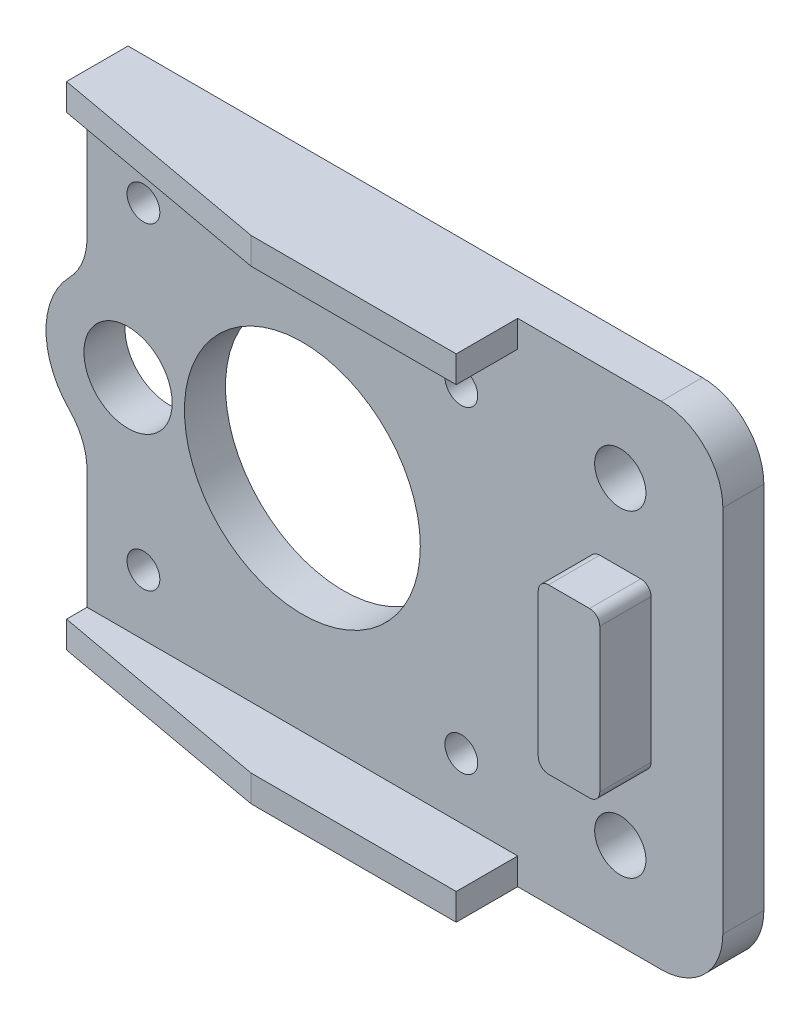
ISO-10303-21;
HEADER;
FILE_DESCRIPTION(('STEP AP214'),'2;1');
FILE_NAME('part.step','',(''),(''),'','','');
FILE_SCHEMA(('AUTOMOTIVE_DESIGN { 1 0 10303 214 1 1 1 1 }'));
ENDSEC;
DATA;
#1=APPLICATION_CONTEXT('core data for automotive mechanical design processes');
#2=APPLICATION_PROTOCOL_DEFINITION('international standard','automotive_design',2000,#1);
#3=PRODUCT_CONTEXT('',#1,'mechanical');
#4=PRODUCT('Part','Part','',(#3));
#5=PRODUCT_RELATED_PRODUCT_CATEGORY('part','',(#4));
#6=PRODUCT_DEFINITION_FORMATION('','',#4);
#7=PRODUCT_DEFINITION_CONTEXT('part definition',#1,'design');
#8=PRODUCT_DEFINITION('design','',#6,#7);
#9=PRODUCT_DEFINITION_SHAPE('','',#8);
#10=(LENGTH_UNIT() NAMED_UNIT(*) SI_UNIT(.MILLI.,.METRE.));
#11=(NAMED_UNIT(*) PLANE_ANGLE_UNIT() SI_UNIT($,.RADIAN.));
#12=(NAMED_UNIT(*) SI_UNIT($,.STERADIAN.) SOLID_ANGLE_UNIT());
#13=UNCERTAINTY_MEASURE_WITH_UNIT(LENGTH_MEASURE(1.E-05),#10,'distance_accuracy_value','');
#14=(GEOMETRIC_REPRESENTATION_CONTEXT(3) GLOBAL_UNCERTAINTY_ASSIGNED_CONTEXT((#13)) GLOBAL_UNIT_ASSIGNED_CONTEXT((#10,
#11,#12)) REPRESENTATION_CONTEXT('',''));
#15=CARTESIAN_POINT('',(0.,0.,0.));
#16=DIRECTION('',(0.,0.,1.));
#17=DIRECTION('',(1.,0.,0.));
#18=AXIS2_PLACEMENT_3D('',#15,#16,#17);
#19=CARTESIAN_POINT('',(35.,-18.,4.));
#20=DIRECTION('',(0.,0.,1.));
#21=DIRECTION('',(1.,0.,0.));
#22=AXIS2_PLACEMENT_3D('',#19,#20,#21);
#23=PLANE('',#22);
#24=DIRECTION('',(1.,0.,0.));
#25=VECTOR('',#24,1.);
#26=CARTESIAN_POINT('',(-21.,-21.4,4.));
#27=LINE('',#26,#25);
#28=CARTESIAN_POINT('',(-21.,-21.4,4.));
#29=VERTEX_POINT('',#28);
#30=CARTESIAN_POINT('',(21.,-21.4,4.));
#31=VERTEX_POINT('',#30);
#32=EDGE_CURVE('E250',#29,#31,#27,.T.);
#33=ORIENTED_EDGE('',*,*,#32,.T.);
#34=DIRECTION('',(0.,1.,0.));
#35=VECTOR('',#34,1.);
#36=CARTESIAN_POINT('',(21.,-24.,4.));
#37=LINE('',#36,#35);
#38=CARTESIAN_POINT('',(21.,-24.,4.));
#39=VERTEX_POINT('',#38);
#40=EDGE_CURVE('E247',#39,#31,#37,.T.);
#41=ORIENTED_EDGE('',*,*,#40,.F.);
#42=DIRECTION('',(1.,0.,0.));
#43=VECTOR('',#42,1.);
#44=CARTESIAN_POINT('',(-21.,-24.,4.));
#45=LINE('',#44,#43);
#46=CARTESIAN_POINT('',(35.,-24.,4.));
#47=VERTEX_POINT('',#46);
#48=EDGE_CURVE('E350',#39,#47,#45,.T.);
#49=ORIENTED_EDGE('',*,*,#48,.T.);
#50=CARTESIAN_POINT('',(35.,-18.,4.));
#51=DIRECTION('',(0.,0.,1.));
#52=DIRECTION('',(1.,0.,0.));
#53=AXIS2_PLACEMENT_3D('',#50,#51,#52);
#54=CIRCLE('',#53,6.);
#55=CARTESIAN_POINT('',(41.,-18.,4.));
#56=VERTEX_POINT('',#55);
#57=EDGE_CURVE('E353',#47,#56,#54,.T.);
#58=ORIENTED_EDGE('',*,*,#57,.T.);
#59=DIRECTION('',(0.,1.,0.));
#60=VECTOR('',#59,1.);
#61=CARTESIAN_POINT('',(41.,18.,4.));
#62=LINE('',#61,#60);
#63=CARTESIAN_POINT('',(41.,18.,4.));
#64=VERTEX_POINT('',#63);
#65=EDGE_CURVE('E355',#56,#64,#62,.T.);
#66=ORIENTED_EDGE('',*,*,#65,.T.);
#67=CARTESIAN_POINT('',(35.,18.,4.));
#68=DIRECTION('',(0.,0.,1.));
#69=DIRECTION('',(-1.,0.,0.));
#70=AXIS2_PLACEMENT_3D('',#67,#68,#69);
#71=CIRCLE('',#70,6.);
#72=CARTESIAN_POINT('',(35.,24.,4.));
#73=VERTEX_POINT('',#72);
#74=EDGE_CURVE('E357',#64,#73,#71,.T.);
#75=ORIENTED_EDGE('',*,*,#74,.T.);
#76=DIRECTION('',(-1.,0.,0.));
#77=VECTOR('',#76,1.);
#78=CARTESIAN_POINT('',(-21.,24.,4.));
#79=LINE('',#78,#77);
#80=CARTESIAN_POINT('',(21.,24.,4.));
#81=VERTEX_POINT('',#80);
#82=EDGE_CURVE('E359',#73,#81,#79,.T.);
#83=ORIENTED_EDGE('',*,*,#82,.T.);
#84=DIRECTION('',(0.,-1.,0.));
#85=VECTOR('',#84,1.);
#86=CARTESIAN_POINT('',(21.,0.,4.));
#87=LINE('',#86,#85);
#88=CARTESIAN_POINT('',(21.,21.4,4.));
#89=VERTEX_POINT('',#88);
#90=EDGE_CURVE('E253',#81,#89,#87,.T.);
#91=ORIENTED_EDGE('',*,*,#90,.T.);
#92=DIRECTION('',(1.,0.,0.));
#93=VECTOR('',#92,1.);
#94=CARTESIAN_POINT('',(0.,21.4,4.));
#95=LINE('',#94,#93);
#96=CARTESIAN_POINT('',(-21.,21.4,4.));
#97=VERTEX_POINT('',#96);
#98=EDGE_CURVE('E263',#97,#89,#95,.T.);
#99=ORIENTED_EDGE('',*,*,#98,.F.);
#100=DIRECTION('',(0.,-1.,0.));
#101=VECTOR('',#100,1.);
#102=CARTESIAN_POINT('',(-21.,24.,4.));
#103=LINE('',#102,#101);
#104=CARTESIAN_POINT('',(-21.,9.79795897113272,4.));
#105=VERTEX_POINT('',#104);
#106=EDGE_CURVE('E367',#97,#105,#103,.T.);
#107=ORIENTED_EDGE('',*,*,#106,.T.);
#108=CARTESIAN_POINT('',(-27.,9.79795897113272,4.));
#109=DIRECTION('',(0.,0.,-1.));
#110=DIRECTION('',(-1.,0.,0.));
#111=AXIS2_PLACEMENT_3D('',#108,#109,#110);
#112=CIRCLE('',#111,6.);
#113=CARTESIAN_POINT('',(-22.7142857142857,5.59883369779013,4.));
#114=VERTEX_POINT('',#113);
#115=EDGE_CURVE('E369',#105,#114,#112,.T.);
#116=ORIENTED_EDGE('',*,*,#115,.T.);
#117=CARTESIAN_POINT('',(-17.,0.,4.));
#118=DIRECTION('',(0.,0.,1.));
#119=DIRECTION('',(1.,0.,0.));
#120=AXIS2_PLACEMENT_3D('',#117,#118,#119);
#121=CIRCLE('',#120,8.);
#122=CARTESIAN_POINT('',(-22.7142857142857,-5.59883369779012,4.));
#123=VERTEX_POINT('',#122);
#124=EDGE_CURVE('E399',#114,#123,#121,.T.);
#125=ORIENTED_EDGE('',*,*,#124,.T.);
#126=CARTESIAN_POINT('',(-27.,-9.79795897113271,4.));
#127=DIRECTION('',(0.,0.,-1.));
#128=DIRECTION('',(1.,0.,0.));
#129=AXIS2_PLACEMENT_3D('',#126,#127,#128);
#130=CIRCLE('',#129,6.);
#131=CARTESIAN_POINT('',(-21.,-9.79795897113271,4.));
#132=VERTEX_POINT('',#131);
#133=EDGE_CURVE('E400',#123,#132,#130,.T.);
#134=ORIENTED_EDGE('',*,*,#133,.T.);
#135=DIRECTION('',(0.,-1.,0.));
#136=VECTOR('',#135,1.);
#137=CARTESIAN_POINT('',(-21.,-9.79795897113271,4.));
#138=LINE('',#137,#136);
#139=EDGE_CURVE('E347',#132,#29,#138,.T.);
#140=ORIENTED_EDGE('',*,*,#139,.T.);
#141=EDGE_LOOP('',(#33,#41,#49,#58,#66,#75,#83,#91,#99,#107,#116,#125,#134,#140));
#142=FACE_BOUND('',#141,.T.);
#143=CARTESIAN_POINT('',(31.,-15.5,4.));
#144=DIRECTION('',(0.,0.,1.));
#145=DIRECTION('',(-1.,0.,0.));
#146=AXIS2_PLACEMENT_3D('',#143,#144,#145);
#147=CIRCLE('',#146,2.50000000000001);
#148=CARTESIAN_POINT('',(28.5,-15.5,4.));
#149=VERTEX_POINT('',#148);
#150=EDGE_CURVE('E298',#149,#149,#147,.T.);
#151=ORIENTED_EDGE('',*,*,#150,.F.);
#152=EDGE_LOOP('',(#151));
#153=FACE_BOUND('',#152,.T.);
#154=CARTESIAN_POINT('',(-15.5,15.5,4.));
#155=DIRECTION('',(0.,0.,1.));
#156=DIRECTION('',(1.,0.,0.));
#157=AXIS2_PLACEMENT_3D('',#154,#155,#156);
#158=CIRCLE('',#157,1.6);
#159=CARTESIAN_POINT('',(-13.9,15.5,4.));
#160=VERTEX_POINT('',#159);
#161=EDGE_CURVE('E311',#160,#160,#158,.T.);
#162=ORIENTED_EDGE('',*,*,#161,.F.);
#163=EDGE_LOOP('',(#162));
#164=FACE_BOUND('',#163,.T.);
#165=CARTESIAN_POINT('',(15.5,-15.5,4.));
#166=DIRECTION('',(0.,0.,1.));
#167=DIRECTION('',(1.,0.,0.));
#168=AXIS2_PLACEMENT_3D('',#165,#166,#167);
#169=CIRCLE('',#168,1.6);
#170=CARTESIAN_POINT('',(17.1,-15.5,4.));
#171=VERTEX_POINT('',#170);
#172=EDGE_CURVE('E323',#171,#171,#169,.T.);
#173=ORIENTED_EDGE('',*,*,#172,.F.);
#174=EDGE_LOOP('',(#173));
#175=FACE_BOUND('',#174,.T.);
#176=CARTESIAN_POINT('',(15.5,15.5,4.));
#177=DIRECTION('',(0.,0.,1.));
#178=DIRECTION('',(1.,0.,0.));
#179=AXIS2_PLACEMENT_3D('',#176,#177,#178);
#180=CIRCLE('',#179,1.6);
#181=CARTESIAN_POINT('',(17.1,15.5,4.));
#182=VERTEX_POINT('',#181);
#183=EDGE_CURVE('E335',#182,#182,#180,.T.);
#184=ORIENTED_EDGE('',*,*,#183,.F.);
#185=EDGE_LOOP('',(#184));
#186=FACE_BOUND('',#185,.T.);
#187=CARTESIAN_POINT('',(0.,0.,4.));
#188=DIRECTION('',(0.,0.,1.));
#189=DIRECTION('',(1.,0.,0.));
#190=AXIS2_PLACEMENT_3D('',#187,#188,#189);
#191=CIRCLE('',#190,11.5);
#192=CARTESIAN_POINT('',(11.5,0.,4.));
#193=VERTEX_POINT('',#192);
#194=EDGE_CURVE('E341',#193,#193,#191,.T.);
#195=ORIENTED_EDGE('',*,*,#194,.F.);
#196=EDGE_LOOP('',(#195));
#197=FACE_BOUND('',#196,.T.);
#198=CARTESIAN_POINT('',(-17.,0.,4.));
#199=DIRECTION('',(0.,0.,1.));
#200=DIRECTION('',(1.,0.,0.));
#201=AXIS2_PLACEMENT_3D('',#198,#199,#200);
#202=CIRCLE('',#201,4.3);
#203=CARTESIAN_POINT('',(-12.7,0.,4.));
#204=VERTEX_POINT('',#203);
#205=EDGE_CURVE('E329',#204,#204,#202,.T.);
#206=ORIENTED_EDGE('',*,*,#205,.F.);
#207=EDGE_LOOP('',(#206));
#208=FACE_BOUND('',#207,.T.);
#209=CARTESIAN_POINT('',(-15.5,-15.5,4.));
#210=DIRECTION('',(0.,0.,1.));
#211=DIRECTION('',(1.,0.,0.));
#212=AXIS2_PLACEMENT_3D('',#209,#210,#211);
#213=CIRCLE('',#212,1.6);
#214=CARTESIAN_POINT('',(-13.9,-15.5,4.));
#215=VERTEX_POINT('',#214);
#216=EDGE_CURVE('E317',#215,#215,#213,.T.);
#217=ORIENTED_EDGE('',*,*,#216,.F.);
#218=EDGE_LOOP('',(#217));
#219=FACE_BOUND('',#218,.T.);
#220=CARTESIAN_POINT('',(31.,15.5,4.));
#221=DIRECTION('',(0.,0.,1.));
#222=DIRECTION('',(1.,0.,0.));
#223=AXIS2_PLACEMENT_3D('',#220,#221,#222);
#224=CIRCLE('',#223,2.50000000000001);
#225=CARTESIAN_POINT('',(33.5,15.5,4.));
#226=VERTEX_POINT('',#225);
#227=EDGE_CURVE('E305',#226,#226,#224,.T.);
#228=ORIENTED_EDGE('',*,*,#227,.F.);
#229=EDGE_LOOP('',(#228));
#230=FACE_BOUND('',#229,.T.);
#231=CARTESIAN_POINT('',(29.,-7.,4.));
#232=DIRECTION('',(0.,0.,1.));
#233=DIRECTION('',(1.,0.,0.));
#234=AXIS2_PLACEMENT_3D('',#231,#232,#233);
#235=CIRCLE('',#234,1.);
#236=CARTESIAN_POINT('',(28.,-6.99999999999999,4.));
#237=VERTEX_POINT('',#236);
#238=CARTESIAN_POINT('',(29.,-8.,4.));
#239=VERTEX_POINT('',#238);
#240=EDGE_CURVE('E874',#237,#239,#235,.T.);
#241=ORIENTED_EDGE('',*,*,#240,.F.);
#242=DIRECTION('',(0.,-1.,0.));
#243=VECTOR('',#242,1.);
#244=CARTESIAN_POINT('',(28.,0.,4.));
#245=LINE('',#244,#243);
#246=CARTESIAN_POINT('',(28.,6.99999999999999,4.));
#247=VERTEX_POINT('',#246);
#248=EDGE_CURVE('E231',#247,#237,#245,.T.);
#249=ORIENTED_EDGE('',*,*,#248,.F.);
#250=CARTESIAN_POINT('',(29.,7.,4.));
#251=DIRECTION('',(0.,0.,1.));
#252=DIRECTION('',(1.,0.,0.));
#253=AXIS2_PLACEMENT_3D('',#250,#251,#252);
#254=CIRCLE('',#253,1.);
#255=CARTESIAN_POINT('',(29.,8.,4.));
#256=VERTEX_POINT('',#255);
#257=EDGE_CURVE('E227',#256,#247,#254,.T.);
#258=ORIENTED_EDGE('',*,*,#257,.F.);
#259=DIRECTION('',(1.,0.,0.));
#260=VECTOR('',#259,1.);
#261=CARTESIAN_POINT('',(0.,8.00000000000001,4.));
#262=LINE('',#261,#260);
#263=CARTESIAN_POINT('',(33.,8.,4.));
#264=VERTEX_POINT('',#263);
#265=EDGE_CURVE('E870',#256,#264,#262,.T.);
#266=ORIENTED_EDGE('',*,*,#265,.T.);
#267=CARTESIAN_POINT('',(33.,7.,4.));
#268=DIRECTION('',(0.,0.,1.));
#269=DIRECTION('',(1.,0.,0.));
#270=AXIS2_PLACEMENT_3D('',#267,#268,#269);
#271=CIRCLE('',#270,1.);
#272=CARTESIAN_POINT('',(34.,6.99999999999999,4.));
#273=VERTEX_POINT('',#272);
#274=EDGE_CURVE('E888',#264,#273,#271,.F.);
#275=ORIENTED_EDGE('',*,*,#274,.T.);
#276=DIRECTION('',(0.,-1.,0.));
#277=VECTOR('',#276,1.);
#278=CARTESIAN_POINT('',(34.,0.,4.));
#279=LINE('',#278,#277);
#280=CARTESIAN_POINT('',(34.,-6.99999999999999,4.));
#281=VERTEX_POINT('',#280);
#282=EDGE_CURVE('E885',#273,#281,#279,.T.);
#283=ORIENTED_EDGE('',*,*,#282,.T.);
#284=CARTESIAN_POINT('',(33.,-7.,4.));
#285=DIRECTION('',(0.,0.,1.));
#286=DIRECTION('',(1.,0.,0.));
#287=AXIS2_PLACEMENT_3D('',#284,#285,#286);
#288=CIRCLE('',#287,1.);
#289=CARTESIAN_POINT('',(33.,-8.,4.));
#290=VERTEX_POINT('',#289);
#291=EDGE_CURVE('E882',#290,#281,#288,.T.);
#292=ORIENTED_EDGE('',*,*,#291,.F.);
#293=DIRECTION('',(1.,0.,0.));
#294=VECTOR('',#293,1.);
#295=CARTESIAN_POINT('',(0.,-7.99999999999999,4.));
#296=LINE('',#295,#294);
#297=EDGE_CURVE('E876',#239,#290,#296,.T.);
#298=ORIENTED_EDGE('',*,*,#297,.F.);
#299=EDGE_LOOP('',(#241,#249,#258,#266,#275,#283,#292,#298));
#300=FACE_BOUND('',#299,.T.);
#301=ADVANCED_FACE('F36',(#142,#153,#164,#175,#186,#197,#208,#219,#230,#300),#23,.T.);
#302=CARTESIAN_POINT('',(35.,-18.,0.));
#303=DIRECTION('',(0.,0.,1.));
#304=DIRECTION('',(1.,0.,0.));
#305=AXIS2_PLACEMENT_3D('',#302,#303,#304);
#306=PLANE('',#305);
#307=CARTESIAN_POINT('',(31.,15.5,0.));
#308=DIRECTION('',(0.,0.,1.));
#309=DIRECTION('',(1.,0.,0.));
#310=AXIS2_PLACEMENT_3D('',#307,#308,#309);
#311=CIRCLE('',#310,2.50000000000001);
#312=CARTESIAN_POINT('',(33.5,15.5,0.));
#313=VERTEX_POINT('',#312);
#314=EDGE_CURVE('E303',#313,#313,#311,.T.);
#315=ORIENTED_EDGE('',*,*,#314,.T.);
#316=EDGE_LOOP('',(#315));
#317=FACE_BOUND('',#316,.T.);
#318=CARTESIAN_POINT('',(-15.5,-15.5,0.));
#319=DIRECTION('',(0.,0.,1.));
#320=DIRECTION('',(1.,0.,0.));
#321=AXIS2_PLACEMENT_3D('',#318,#319,#320);
#322=CIRCLE('',#321,1.6);
#323=CARTESIAN_POINT('',(-13.9,-15.5,0.));
#324=VERTEX_POINT('',#323);
#325=EDGE_CURVE('E314',#324,#324,#322,.T.);
#326=ORIENTED_EDGE('',*,*,#325,.T.);
#327=EDGE_LOOP('',(#326));
#328=FACE_BOUND('',#327,.T.);
#329=CARTESIAN_POINT('',(-17.,0.,0.));
#330=DIRECTION('',(0.,0.,1.));
#331=DIRECTION('',(1.,0.,0.));
#332=AXIS2_PLACEMENT_3D('',#329,#330,#331);
#333=CIRCLE('',#332,4.3);
#334=CARTESIAN_POINT('',(-12.7,0.,0.));
#335=VERTEX_POINT('',#334);
#336=EDGE_CURVE('E326',#335,#335,#333,.T.);
#337=ORIENTED_EDGE('',*,*,#336,.T.);
#338=EDGE_LOOP('',(#337));
#339=FACE_BOUND('',#338,.T.);
#340=CARTESIAN_POINT('',(0.,0.,0.));
#341=DIRECTION('',(0.,0.,1.));
#342=DIRECTION('',(1.,0.,0.));
#343=AXIS2_PLACEMENT_3D('',#340,#341,#342);
#344=CIRCLE('',#343,11.5);
#345=CARTESIAN_POINT('',(11.5,0.,0.));
#346=VERTEX_POINT('',#345);
#347=EDGE_CURVE('E338',#346,#346,#344,.T.);
#348=ORIENTED_EDGE('',*,*,#347,.T.);
#349=EDGE_LOOP('',(#348));
#350=FACE_BOUND('',#349,.T.);
#351=DIRECTION('',(0.,-1.,0.));
#352=VECTOR('',#351,1.);
#353=CARTESIAN_POINT('',(-21.,-9.79795897113271,0.));
#354=LINE('',#353,#352);
#355=CARTESIAN_POINT('',(-21.,-9.79795897113271,0.));
#356=VERTEX_POINT('',#355);
#357=CARTESIAN_POINT('',(-21.,-24.,0.));
#358=VERTEX_POINT('',#357);
#359=EDGE_CURVE('E344',#356,#358,#354,.T.);
#360=ORIENTED_EDGE('',*,*,#359,.F.);
#361=CARTESIAN_POINT('',(-27.,-9.79795897113271,0.));
#362=DIRECTION('',(0.,0.,-1.));
#363=DIRECTION('',(1.,0.,0.));
#364=AXIS2_PLACEMENT_3D('',#361,#362,#363);
#365=CIRCLE('',#364,6.);
#366=CARTESIAN_POINT('',(-22.7142857142857,-5.59883369779012,0.));
#367=VERTEX_POINT('',#366);
#368=EDGE_CURVE('E351',#367,#356,#365,.T.);
#369=ORIENTED_EDGE('',*,*,#368,.F.);
#370=CARTESIAN_POINT('',(-17.,0.,0.));
#371=DIRECTION('',(0.,0.,1.));
#372=DIRECTION('',(1.,0.,0.));
#373=AXIS2_PLACEMENT_3D('',#370,#371,#372);
#374=CIRCLE('',#373,8.);
#375=CARTESIAN_POINT('',(-22.7142857142857,5.59883369779013,0.));
#376=VERTEX_POINT('',#375);
#377=EDGE_CURVE('E421',#376,#367,#374,.T.);
#378=ORIENTED_EDGE('',*,*,#377,.F.);
#379=CARTESIAN_POINT('',(-27.,9.79795897113272,0.));
#380=DIRECTION('',(0.,0.,-1.));
#381=DIRECTION('',(-1.,0.,0.));
#382=AXIS2_PLACEMENT_3D('',#379,#380,#381);
#383=CIRCLE('',#382,6.);
#384=CARTESIAN_POINT('',(-21.,9.79795897113272,0.));
#385=VERTEX_POINT('',#384);
#386=EDGE_CURVE('E419',#385,#376,#383,.T.);
#387=ORIENTED_EDGE('',*,*,#386,.F.);
#388=DIRECTION('',(0.,-1.,0.));
#389=VECTOR('',#388,1.);
#390=CARTESIAN_POINT('',(-21.,24.,0.));
#391=LINE('',#390,#389);
#392=CARTESIAN_POINT('',(-21.,24.,0.));
#393=VERTEX_POINT('',#392);
#394=EDGE_CURVE('E389',#393,#385,#391,.T.);
#395=ORIENTED_EDGE('',*,*,#394,.F.);
#396=DIRECTION('',(-1.,0.,0.));
#397=VECTOR('',#396,1.);
#398=CARTESIAN_POINT('',(-21.,24.,0.));
#399=LINE('',#398,#397);
#400=CARTESIAN_POINT('',(35.,24.,0.));
#401=VERTEX_POINT('',#400);
#402=EDGE_CURVE('E415',#401,#393,#399,.T.);
#403=ORIENTED_EDGE('',*,*,#402,.F.);
#404=CARTESIAN_POINT('',(35.,18.,0.));
#405=DIRECTION('',(0.,0.,1.));
#406=DIRECTION('',(-1.,0.,0.));
#407=AXIS2_PLACEMENT_3D('',#404,#405,#406);
#408=CIRCLE('',#407,6.);
#409=CARTESIAN_POINT('',(41.,18.,0.));
#410=VERTEX_POINT('',#409);
#411=EDGE_CURVE('E413',#410,#401,#408,.T.);
#412=ORIENTED_EDGE('',*,*,#411,.F.);
#413=DIRECTION('',(0.,1.,0.));
#414=VECTOR('',#413,1.);
#415=CARTESIAN_POINT('',(41.,18.,0.));
#416=LINE('',#415,#414);
#417=CARTESIAN_POINT('',(41.,-18.,0.));
#418=VERTEX_POINT('',#417);
#419=EDGE_CURVE('E411',#418,#410,#416,.T.);
#420=ORIENTED_EDGE('',*,*,#419,.F.);
#421=CARTESIAN_POINT('',(35.,-18.,0.));
#422=DIRECTION('',(0.,0.,1.));
#423=DIRECTION('',(1.,0.,0.));
#424=AXIS2_PLACEMENT_3D('',#421,#422,#423);
#425=CIRCLE('',#424,6.);
#426=CARTESIAN_POINT('',(35.,-24.,0.));
#427=VERTEX_POINT('',#426);
#428=EDGE_CURVE('E409',#427,#418,#425,.T.);
#429=ORIENTED_EDGE('',*,*,#428,.F.);
#430=DIRECTION('',(1.,0.,0.));
#431=VECTOR('',#430,1.);
#432=CARTESIAN_POINT('',(-21.,-24.,0.));
#433=LINE('',#432,#431);
#434=EDGE_CURVE('E407',#358,#427,#433,.T.);
#435=ORIENTED_EDGE('',*,*,#434,.F.);
#436=EDGE_LOOP('',(#360,#369,#378,#387,#395,#403,#412,#420,#429,#435));
#437=FACE_BOUND('',#436,.T.);
#438=CARTESIAN_POINT('',(15.5,15.5,0.));
#439=DIRECTION('',(0.,0.,1.));
#440=DIRECTION('',(1.,0.,0.));
#441=AXIS2_PLACEMENT_3D('',#438,#439,#440);
#442=CIRCLE('',#441,1.6);
#443=CARTESIAN_POINT('',(17.1,15.5,0.));
#444=VERTEX_POINT('',#443);
#445=EDGE_CURVE('E332',#444,#444,#442,.T.);
#446=ORIENTED_EDGE('',*,*,#445,.T.);
#447=EDGE_LOOP('',(#446));
#448=FACE_BOUND('',#447,.T.);
#449=CARTESIAN_POINT('',(15.5,-15.5,0.));
#450=DIRECTION('',(0.,0.,1.));
#451=DIRECTION('',(1.,0.,0.));
#452=AXIS2_PLACEMENT_3D('',#449,#450,#451);
#453=CIRCLE('',#452,1.6);
#454=CARTESIAN_POINT('',(17.1,-15.5,0.));
#455=VERTEX_POINT('',#454);
#456=EDGE_CURVE('E320',#455,#455,#453,.T.);
#457=ORIENTED_EDGE('',*,*,#456,.T.);
#458=EDGE_LOOP('',(#457));
#459=FACE_BOUND('',#458,.T.);
#460=CARTESIAN_POINT('',(-15.5,15.5,0.));
#461=DIRECTION('',(0.,0.,1.));
#462=DIRECTION('',(1.,0.,0.));
#463=AXIS2_PLACEMENT_3D('',#460,#461,#462);
#464=CIRCLE('',#463,1.6);
#465=CARTESIAN_POINT('',(-13.9,15.5,0.));
#466=VERTEX_POINT('',#465);
#467=EDGE_CURVE('E308',#466,#466,#464,.T.);
#468=ORIENTED_EDGE('',*,*,#467,.T.);
#469=EDGE_LOOP('',(#468));
#470=FACE_BOUND('',#469,.T.);
#471=CARTESIAN_POINT('',(31.,-15.5,0.));
#472=DIRECTION('',(0.,0.,1.));
#473=DIRECTION('',(-1.,0.,0.));
#474=AXIS2_PLACEMENT_3D('',#471,#472,#473);
#475=CIRCLE('',#474,2.50000000000001);
#476=CARTESIAN_POINT('',(28.5,-15.5,0.));
#477=VERTEX_POINT('',#476);
#478=EDGE_CURVE('E292',#477,#477,#475,.T.);
#479=ORIENTED_EDGE('',*,*,#478,.T.);
#480=EDGE_LOOP('',(#479));
#481=FACE_BOUND('',#480,.T.);
#482=ADVANCED_FACE('F455',(#317,#328,#339,#350,#437,#448,#459,#470,#481),#306,.F.);
#483=CARTESIAN_POINT('',(-21.,-9.79795897113271,4.));
#484=DIRECTION('',(1.,0.,0.));
#485=DIRECTION('',(0.,1.,0.));
#486=AXIS2_PLACEMENT_3D('',#483,#484,#485);
#487=PLANE('',#486);
#488=DIRECTION('',(0.,0.,-1.));
#489=VECTOR('',#488,1.);
#490=CARTESIAN_POINT('',(-21.,-24.,4.));
#491=LINE('',#490,#489);
#492=CARTESIAN_POINT('',(-21.,-24.,6.));
#493=VERTEX_POINT('',#492);
#494=EDGE_CURVE('E281',#493,#358,#491,.T.);
#495=ORIENTED_EDGE('',*,*,#494,.F.);
#496=DIRECTION('',(0.,1.,0.));
#497=VECTOR('',#496,1.);
#498=CARTESIAN_POINT('',(-21.,-9.79795897113271,6.));
#499=LINE('',#498,#497);
#500=CARTESIAN_POINT('',(-21.,-21.4,6.));
#501=VERTEX_POINT('',#500);
#502=EDGE_CURVE('E856',#493,#501,#499,.T.);
#503=ORIENTED_EDGE('',*,*,#502,.T.);
#504=DIRECTION('',(0.,0.,-1.));
#505=VECTOR('',#504,1.);
#506=CARTESIAN_POINT('',(-21.,-21.4,10.));
#507=LINE('',#506,#505);
#508=EDGE_CURVE('E242',#501,#29,#507,.T.);
#509=ORIENTED_EDGE('',*,*,#508,.T.);
#510=ORIENTED_EDGE('',*,*,#139,.F.);
#511=DIRECTION('',(0.,0.,-1.));
#512=VECTOR('',#511,1.);
#513=CARTESIAN_POINT('',(-21.,-9.79795897113271,4.));
#514=LINE('',#513,#512);
#515=EDGE_CURVE('E404',#132,#356,#514,.T.);
#516=ORIENTED_EDGE('',*,*,#515,.T.);
#517=ORIENTED_EDGE('',*,*,#359,.T.);
#518=EDGE_LOOP('',(#495,#503,#509,#510,#516,#517));
#519=FACE_BOUND('',#518,.T.);
#520=ADVANCED_FACE('F459',(#519),#487,.F.);
#521=CARTESIAN_POINT('',(-21.,-24.,4.));
#522=DIRECTION('',(0.,1.,0.));
#523=DIRECTION('',(0.,0.,1.));
#524=AXIS2_PLACEMENT_3D('',#521,#522,#523);
#525=PLANE('',#524);
#526=DIRECTION('',(1.,0.,0.));
#527=VECTOR('',#526,1.);
#528=CARTESIAN_POINT('',(-21.,-24.,10.));
#529=LINE('',#528,#527);
#530=CARTESIAN_POINT('',(1.00000000000043,-24.,10.));
#531=VERTEX_POINT('',#530);
#532=CARTESIAN_POINT('',(21.,-24.,10.));
#533=VERTEX_POINT('',#532);
#534=EDGE_CURVE('E244',#531,#533,#529,.T.);
#535=ORIENTED_EDGE('',*,*,#534,.F.);
#536=DIRECTION('',(0.983869910099908,0.,0.17888543819998));
#537=VECTOR('',#536,1.);
#538=CARTESIAN_POINT('',(-21.,-24.,6.));
#539=LINE('',#538,#537);
#540=EDGE_CURVE('E11',#531,#493,#539,.F.);
#541=ORIENTED_EDGE('',*,*,#540,.T.);
#542=ORIENTED_EDGE('',*,*,#494,.T.);
#543=ORIENTED_EDGE('',*,*,#434,.T.);
#544=DIRECTION('',(0.,0.,-1.));
#545=VECTOR('',#544,1.);
#546=CARTESIAN_POINT('',(35.,-24.,4.));
#547=LINE('',#546,#545);
#548=EDGE_CURVE('E439',#47,#427,#547,.T.);
#549=ORIENTED_EDGE('',*,*,#548,.F.);
#550=ORIENTED_EDGE('',*,*,#48,.F.);
#551=DIRECTION('',(0.,0.,-1.));
#552=VECTOR('',#551,1.);
#553=CARTESIAN_POINT('',(21.,-24.,10.));
#554=LINE('',#553,#552);
#555=EDGE_CURVE('E233',#533,#39,#554,.T.);
#556=ORIENTED_EDGE('',*,*,#555,.F.);
#557=EDGE_LOOP('',(#535,#541,#542,#543,#549,#550,#556));
#558=FACE_BOUND('',#557,.T.);
#559=ADVANCED_FACE('F448',(#558),#525,.F.);
#560=CARTESIAN_POINT('',(35.,-18.,4.));
#561=DIRECTION('',(0.,0.,-1.));
#562=DIRECTION('',(-1.,0.,0.));
#563=AXIS2_PLACEMENT_3D('',#560,#561,#562);
#564=CYLINDRICAL_SURFACE('',#563,6.);
#565=ORIENTED_EDGE('',*,*,#428,.T.);
#566=DIRECTION('',(0.,0.,-1.));
#567=VECTOR('',#566,1.);
#568=CARTESIAN_POINT('',(41.,-18.,4.));
#569=LINE('',#568,#567);
#570=EDGE_CURVE('E437',#56,#418,#569,.T.);
#571=ORIENTED_EDGE('',*,*,#570,.F.);
#572=ORIENTED_EDGE('',*,*,#57,.F.);
#573=ORIENTED_EDGE('',*,*,#548,.T.);
#574=EDGE_LOOP('',(#565,#571,#572,#573));
#575=FACE_BOUND('',#574,.T.);
#576=ADVANCED_FACE('F478',(#575),#564,.T.);
#577=CARTESIAN_POINT('',(41.,18.,4.));
#578=DIRECTION('',(-1.,0.,0.));
#579=DIRECTION('',(0.,-1.,0.));
#580=AXIS2_PLACEMENT_3D('',#577,#578,#579);
#581=PLANE('',#580);
#582=ORIENTED_EDGE('',*,*,#419,.T.);
#583=DIRECTION('',(0.,0.,-1.));
#584=VECTOR('',#583,1.);
#585=CARTESIAN_POINT('',(41.,18.,4.));
#586=LINE('',#585,#584);
#587=EDGE_CURVE('E434',#64,#410,#586,.T.);
#588=ORIENTED_EDGE('',*,*,#587,.F.);
#589=ORIENTED_EDGE('',*,*,#65,.F.);
#590=ORIENTED_EDGE('',*,*,#570,.T.);
#591=EDGE_LOOP('',(#582,#588,#589,#590));
#592=FACE_BOUND('',#591,.T.);
#593=ADVANCED_FACE('F482',(#592),#581,.F.);
#594=CARTESIAN_POINT('',(35.,18.,4.));
#595=DIRECTION('',(0.,0.,-1.));
#596=DIRECTION('',(-1.,0.,0.));
#597=AXIS2_PLACEMENT_3D('',#594,#595,#596);
#598=CYLINDRICAL_SURFACE('',#597,6.);
#599=ORIENTED_EDGE('',*,*,#411,.T.);
#600=DIRECTION('',(0.,0.,-1.));
#601=VECTOR('',#600,1.);
#602=CARTESIAN_POINT('',(35.,24.,4.));
#603=LINE('',#602,#601);
#604=EDGE_CURVE('E431',#73,#401,#603,.T.);
#605=ORIENTED_EDGE('',*,*,#604,.F.);
#606=ORIENTED_EDGE('',*,*,#74,.F.);
#607=ORIENTED_EDGE('',*,*,#587,.T.);
#608=EDGE_LOOP('',(#599,#605,#606,#607));
#609=FACE_BOUND('',#608,.T.);
#610=ADVANCED_FACE('F486',(#609),#598,.T.);
#611=CARTESIAN_POINT('',(-21.,24.,4.));
#612=DIRECTION('',(0.,-1.,0.));
#613=DIRECTION('',(0.,0.,-1.));
#614=AXIS2_PLACEMENT_3D('',#611,#612,#613);
#615=PLANE('',#614);
#616=DIRECTION('',(0.,0.,-1.));
#617=VECTOR('',#616,1.);
#618=CARTESIAN_POINT('',(-21.,24.,4.));
#619=LINE('',#618,#617);
#620=CARTESIAN_POINT('',(-21.,24.,5.99999999999999));
#621=VERTEX_POINT('',#620);
#622=EDGE_CURVE('E392',#621,#393,#619,.T.);
#623=ORIENTED_EDGE('',*,*,#622,.F.);
#624=DIRECTION('',(0.983869910099908,0.,0.17888543819998));
#625=VECTOR('',#624,1.);
#626=CARTESIAN_POINT('',(1.00000000000041,24.,10.));
#627=LINE('',#626,#625);
#628=CARTESIAN_POINT('',(1.0000000000004,24.,10.));
#629=VERTEX_POINT('',#628);
#630=EDGE_CURVE('E857',#621,#629,#627,.T.);
#631=ORIENTED_EDGE('',*,*,#630,.T.);
#632=DIRECTION('',(-1.,0.,0.));
#633=VECTOR('',#632,1.);
#634=CARTESIAN_POINT('',(0.,24.,10.));
#635=LINE('',#634,#633);
#636=CARTESIAN_POINT('',(21.,24.,10.));
#637=VERTEX_POINT('',#636);
#638=EDGE_CURVE('E262',#637,#629,#635,.T.);
#639=ORIENTED_EDGE('',*,*,#638,.F.);
#640=DIRECTION('',(0.,0.,-1.));
#641=VECTOR('',#640,1.);
#642=CARTESIAN_POINT('',(21.,24.,10.));
#643=LINE('',#642,#641);
#644=EDGE_CURVE('E285',#637,#81,#643,.T.);
#645=ORIENTED_EDGE('',*,*,#644,.T.);
#646=ORIENTED_EDGE('',*,*,#82,.F.);
#647=ORIENTED_EDGE('',*,*,#604,.T.);
#648=ORIENTED_EDGE('',*,*,#402,.T.);
#649=EDGE_LOOP('',(#623,#631,#639,#645,#646,#647,#648));
#650=FACE_BOUND('',#649,.T.);
#651=ADVANCED_FACE('F490',(#650),#615,.F.);
#652=CARTESIAN_POINT('',(-21.,24.,4.));
#653=DIRECTION('',(1.,0.,0.));
#654=DIRECTION('',(0.,1.,0.));
#655=AXIS2_PLACEMENT_3D('',#652,#653,#654);
#656=PLANE('',#655);
#657=DIRECTION('',(0.,0.,-1.));
#658=VECTOR('',#657,1.);
#659=CARTESIAN_POINT('',(-21.,21.4,10.));
#660=LINE('',#659,#658);
#661=CARTESIAN_POINT('',(-21.,21.4,6.));
#662=VERTEX_POINT('',#661);
#663=EDGE_CURVE('E282',#662,#97,#660,.T.);
#664=ORIENTED_EDGE('',*,*,#663,.F.);
#665=DIRECTION('',(0.,1.,0.));
#666=VECTOR('',#665,1.);
#667=CARTESIAN_POINT('',(-21.,24.,6.));
#668=LINE('',#667,#666);
#669=EDGE_CURVE('E860',#662,#621,#668,.T.);
#670=ORIENTED_EDGE('',*,*,#669,.T.);
#671=ORIENTED_EDGE('',*,*,#622,.T.);
#672=ORIENTED_EDGE('',*,*,#394,.T.);
#673=DIRECTION('',(0.,0.,-1.));
#674=VECTOR('',#673,1.);
#675=CARTESIAN_POINT('',(-21.,9.79795897113272,4.));
#676=LINE('',#675,#674);
#677=EDGE_CURVE('E386',#105,#385,#676,.T.);
#678=ORIENTED_EDGE('',*,*,#677,.F.);
#679=ORIENTED_EDGE('',*,*,#106,.F.);
#680=EDGE_LOOP('',(#664,#670,#671,#672,#678,#679));
#681=FACE_BOUND('',#680,.T.);
#682=ADVANCED_FACE('F383',(#681),#656,.F.);
#683=CARTESIAN_POINT('',(-27.,9.79795897113272,4.));
#684=DIRECTION('',(0.,0.,-1.));
#685=DIRECTION('',(-1.,0.,0.));
#686=AXIS2_PLACEMENT_3D('',#683,#684,#685);
#687=CYLINDRICAL_SURFACE('',#686,6.);
#688=ORIENTED_EDGE('',*,*,#386,.T.);
#689=DIRECTION('',(0.,0.,-1.));
#690=VECTOR('',#689,1.);
#691=CARTESIAN_POINT('',(-22.7142857142857,5.59883369779013,4.));
#692=LINE('',#691,#690);
#693=EDGE_CURVE('E393',#114,#376,#692,.T.);
#694=ORIENTED_EDGE('',*,*,#693,.F.);
#695=ORIENTED_EDGE('',*,*,#115,.F.);
#696=ORIENTED_EDGE('',*,*,#677,.T.);
#697=EDGE_LOOP('',(#688,#694,#695,#696));
#698=FACE_BOUND('',#697,.T.);
#699=ADVANCED_FACE('F396',(#698),#687,.F.);
#700=CARTESIAN_POINT('',(-17.,0.,4.));
#701=DIRECTION('',(0.,0.,-1.));
#702=DIRECTION('',(-1.,0.,0.));
#703=AXIS2_PLACEMENT_3D('',#700,#701,#702);
#704=CYLINDRICAL_SURFACE('',#703,8.);
#705=ORIENTED_EDGE('',*,*,#377,.T.);
#706=DIRECTION('',(0.,0.,-1.));
#707=VECTOR('',#706,1.);
#708=CARTESIAN_POINT('',(-22.7142857142857,-5.59883369779012,4.));
#709=LINE('',#708,#707);
#710=EDGE_CURVE('E426',#123,#367,#709,.T.);
#711=ORIENTED_EDGE('',*,*,#710,.F.);
#712=ORIENTED_EDGE('',*,*,#124,.F.);
#713=ORIENTED_EDGE('',*,*,#693,.T.);
#714=EDGE_LOOP('',(#705,#711,#712,#713));
#715=FACE_BOUND('',#714,.T.);
#716=ADVANCED_FACE('F468',(#715),#704,.T.);
#717=CARTESIAN_POINT('',(-27.,-9.79795897113271,4.));
#718=DIRECTION('',(0.,0.,-1.));
#719=DIRECTION('',(-1.,0.,0.));
#720=AXIS2_PLACEMENT_3D('',#717,#718,#719);
#721=CYLINDRICAL_SURFACE('',#720,6.);
#722=ORIENTED_EDGE('',*,*,#368,.T.);
#723=ORIENTED_EDGE('',*,*,#515,.F.);
#724=ORIENTED_EDGE('',*,*,#133,.F.);
#725=ORIENTED_EDGE('',*,*,#710,.T.);
#726=EDGE_LOOP('',(#722,#723,#724,#725));
#727=FACE_BOUND('',#726,.T.);
#728=ADVANCED_FACE('F464',(#727),#721,.F.);
#729=CARTESIAN_POINT('',(0.,0.,4.));
#730=DIRECTION('',(0.,0.,-1.));
#731=DIRECTION('',(-1.,0.,0.));
#732=AXIS2_PLACEMENT_3D('',#729,#730,#731);
#733=CYLINDRICAL_SURFACE('',#732,11.5);
#734=ORIENTED_EDGE('',*,*,#194,.T.);
#735=EDGE_LOOP('',(#734));
#736=FACE_BOUND('',#735,.T.);
#737=ORIENTED_EDGE('',*,*,#347,.F.);
#738=EDGE_LOOP('',(#737));
#739=FACE_BOUND('',#738,.T.);
#740=ADVANCED_FACE('F508',(#736,#739),#733,.F.);
#741=CARTESIAN_POINT('',(15.5,15.5,4.));
#742=DIRECTION('',(0.,0.,-1.));
#743=DIRECTION('',(-1.,0.,0.));
#744=AXIS2_PLACEMENT_3D('',#741,#742,#743);
#745=CYLINDRICAL_SURFACE('',#744,1.6);
#746=ORIENTED_EDGE('',*,*,#183,.T.);
#747=EDGE_LOOP('',(#746));
#748=FACE_BOUND('',#747,.T.);
#749=ORIENTED_EDGE('',*,*,#445,.F.);
#750=EDGE_LOOP('',(#749));
#751=FACE_BOUND('',#750,.T.);
#752=ADVANCED_FACE('F535',(#748,#751),#745,.F.);
#753=CARTESIAN_POINT('',(-17.,0.,4.));
#754=DIRECTION('',(0.,0.,-1.));
#755=DIRECTION('',(-1.,0.,0.));
#756=AXIS2_PLACEMENT_3D('',#753,#754,#755);
#757=CYLINDRICAL_SURFACE('',#756,4.3);
#758=ORIENTED_EDGE('',*,*,#205,.T.);
#759=EDGE_LOOP('',(#758));
#760=FACE_BOUND('',#759,.T.);
#761=ORIENTED_EDGE('',*,*,#336,.F.);
#762=EDGE_LOOP('',(#761));
#763=FACE_BOUND('',#762,.T.);
#764=ADVANCED_FACE('F542',(#760,#763),#757,.F.);
#765=CARTESIAN_POINT('',(15.5,-15.5,4.));
#766=DIRECTION('',(0.,0.,-1.));
#767=DIRECTION('',(-1.,0.,0.));
#768=AXIS2_PLACEMENT_3D('',#765,#766,#767);
#769=CYLINDRICAL_SURFACE('',#768,1.6);
#770=ORIENTED_EDGE('',*,*,#172,.T.);
#771=EDGE_LOOP('',(#770));
#772=FACE_BOUND('',#771,.T.);
#773=ORIENTED_EDGE('',*,*,#456,.F.);
#774=EDGE_LOOP('',(#773));
#775=FACE_BOUND('',#774,.T.);
#776=ADVANCED_FACE('F549',(#772,#775),#769,.F.);
#777=CARTESIAN_POINT('',(-15.5,-15.5,4.));
#778=DIRECTION('',(0.,0.,-1.));
#779=DIRECTION('',(-1.,0.,0.));
#780=AXIS2_PLACEMENT_3D('',#777,#778,#779);
#781=CYLINDRICAL_SURFACE('',#780,1.6);
#782=ORIENTED_EDGE('',*,*,#216,.T.);
#783=EDGE_LOOP('',(#782));
#784=FACE_BOUND('',#783,.T.);
#785=ORIENTED_EDGE('',*,*,#325,.F.);
#786=EDGE_LOOP('',(#785));
#787=FACE_BOUND('',#786,.T.);
#788=ADVANCED_FACE('F557',(#784,#787),#781,.F.);
#789=CARTESIAN_POINT('',(-15.5,15.5,4.));
#790=DIRECTION('',(0.,0.,-1.));
#791=DIRECTION('',(-1.,0.,0.));
#792=AXIS2_PLACEMENT_3D('',#789,#790,#791);
#793=CYLINDRICAL_SURFACE('',#792,1.6);
#794=ORIENTED_EDGE('',*,*,#161,.T.);
#795=EDGE_LOOP('',(#794));
#796=FACE_BOUND('',#795,.T.);
#797=ORIENTED_EDGE('',*,*,#467,.F.);
#798=EDGE_LOOP('',(#797));
#799=FACE_BOUND('',#798,.T.);
#800=ADVANCED_FACE('F565',(#796,#799),#793,.F.);
#801=CARTESIAN_POINT('',(31.,15.5,4.));
#802=DIRECTION('',(0.,0.,-1.));
#803=DIRECTION('',(-1.,0.,0.));
#804=AXIS2_PLACEMENT_3D('',#801,#802,#803);
#805=CYLINDRICAL_SURFACE('',#804,2.50000000000001);
#806=ORIENTED_EDGE('',*,*,#227,.T.);
#807=EDGE_LOOP('',(#806));
#808=FACE_BOUND('',#807,.T.);
#809=ORIENTED_EDGE('',*,*,#314,.F.);
#810=EDGE_LOOP('',(#809));
#811=FACE_BOUND('',#810,.T.);
#812=ADVANCED_FACE('F573',(#808,#811),#805,.F.);
#813=CARTESIAN_POINT('',(31.,-15.5,4.));
#814=DIRECTION('',(0.,0.,-1.));
#815=DIRECTION('',(-1.,0.,0.));
#816=AXIS2_PLACEMENT_3D('',#813,#814,#815);
#817=CYLINDRICAL_SURFACE('',#816,2.50000000000001);
#818=ORIENTED_EDGE('',*,*,#150,.T.);
#819=EDGE_LOOP('',(#818));
#820=FACE_BOUND('',#819,.T.);
#821=ORIENTED_EDGE('',*,*,#478,.F.);
#822=EDGE_LOOP('',(#821));
#823=FACE_BOUND('',#822,.T.);
#824=ADVANCED_FACE('F581',(#820,#823),#817,.F.);
#825=CARTESIAN_POINT('',(21.,0.,10.));
#826=DIRECTION('',(1.,0.,0.));
#827=DIRECTION('',(0.,0.,-1.));
#828=AXIS2_PLACEMENT_3D('',#825,#826,#827);
#829=PLANE('',#828);
#830=ORIENTED_EDGE('',*,*,#90,.F.);
#831=ORIENTED_EDGE('',*,*,#644,.F.);
#832=DIRECTION('',(0.,-1.,0.));
#833=VECTOR('',#832,1.);
#834=CARTESIAN_POINT('',(21.,0.,10.));
#835=LINE('',#834,#833);
#836=CARTESIAN_POINT('',(21.,21.4,10.));
#837=VERTEX_POINT('',#836);
#838=EDGE_CURVE('E259',#637,#837,#835,.T.);
#839=ORIENTED_EDGE('',*,*,#838,.T.);
#840=DIRECTION('',(0.,0.,-1.));
#841=VECTOR('',#840,1.);
#842=CARTESIAN_POINT('',(21.,21.4,10.));
#843=LINE('',#842,#841);
#844=EDGE_CURVE('E268',#837,#89,#843,.T.);
#845=ORIENTED_EDGE('',*,*,#844,.T.);
#846=EDGE_LOOP('',(#830,#831,#839,#845));
#847=FACE_BOUND('',#846,.T.);
#848=ADVANCED_FACE('F589',(#847),#829,.T.);
#849=CARTESIAN_POINT('',(0.,21.4,10.));
#850=DIRECTION('',(0.,1.,0.));
#851=DIRECTION('',(-1.,0.,0.));
#852=AXIS2_PLACEMENT_3D('',#849,#850,#851);
#853=PLANE('',#852);
#854=DIRECTION('',(1.,0.,0.));
#855=VECTOR('',#854,1.);
#856=CARTESIAN_POINT('',(0.,21.4,10.));
#857=LINE('',#856,#855);
#858=CARTESIAN_POINT('',(1.0000000000004,21.4,10.));
#859=VERTEX_POINT('',#858);
#860=EDGE_CURVE('E266',#859,#837,#857,.T.);
#861=ORIENTED_EDGE('',*,*,#860,.F.);
#862=DIRECTION('',(-0.983869910099908,0.,-0.17888543819998));
#863=VECTOR('',#862,1.);
#864=CARTESIAN_POINT('',(1.00000000000041,21.4,10.));
#865=LINE('',#864,#863);
#866=EDGE_CURVE('E280',#859,#662,#865,.T.);
#867=ORIENTED_EDGE('',*,*,#866,.T.);
#868=ORIENTED_EDGE('',*,*,#663,.T.);
#869=ORIENTED_EDGE('',*,*,#98,.T.);
#870=ORIENTED_EDGE('',*,*,#844,.F.);
#871=EDGE_LOOP('',(#861,#867,#868,#869,#870));
#872=FACE_BOUND('',#871,.T.);
#873=ADVANCED_FACE('F375',(#872),#853,.F.);
#874=CARTESIAN_POINT('',(0.,0.,10.));
#875=DIRECTION('',(0.,0.,1.));
#876=DIRECTION('',(1.,0.,0.));
#877=AXIS2_PLACEMENT_3D('',#874,#875,#876);
#878=PLANE('',#877);
#879=ORIENTED_EDGE('',*,*,#638,.T.);
#880=DIRECTION('',(0.,-1.,0.));
#881=VECTOR('',#880,1.);
#882=CARTESIAN_POINT('',(1.0000000000004,21.4,10.));
#883=LINE('',#882,#881);
#884=EDGE_CURVE('E277',#629,#859,#883,.T.);
#885=ORIENTED_EDGE('',*,*,#884,.T.);
#886=ORIENTED_EDGE('',*,*,#860,.T.);
#887=ORIENTED_EDGE('',*,*,#838,.F.);
#888=EDGE_LOOP('',(#879,#885,#886,#887));
#889=FACE_BOUND('',#888,.T.);
#890=ADVANCED_FACE('F605',(#889),#878,.T.);
#891=CARTESIAN_POINT('',(21.,-24.,10.));
#892=DIRECTION('',(-1.,0.,0.));
#893=DIRECTION('',(0.,0.,1.));
#894=AXIS2_PLACEMENT_3D('',#891,#892,#893);
#895=PLANE('',#894);
#896=ORIENTED_EDGE('',*,*,#40,.T.);
#897=DIRECTION('',(0.,0.,-1.));
#898=VECTOR('',#897,1.);
#899=CARTESIAN_POINT('',(21.,-21.4,10.));
#900=LINE('',#899,#898);
#901=CARTESIAN_POINT('',(21.,-21.4,10.));
#902=VERTEX_POINT('',#901);
#903=EDGE_CURVE('E236',#902,#31,#900,.T.);
#904=ORIENTED_EDGE('',*,*,#903,.F.);
#905=DIRECTION('',(0.,1.,0.));
#906=VECTOR('',#905,1.);
#907=CARTESIAN_POINT('',(21.,-24.,10.));
#908=LINE('',#907,#906);
#909=EDGE_CURVE('E255',#533,#902,#908,.T.);
#910=ORIENTED_EDGE('',*,*,#909,.F.);
#911=ORIENTED_EDGE('',*,*,#555,.T.);
#912=EDGE_LOOP('',(#896,#904,#910,#911));
#913=FACE_BOUND('',#912,.T.);
#914=ADVANCED_FACE('F475',(#913),#895,.F.);
#915=CARTESIAN_POINT('',(-21.,-21.4,10.));
#916=DIRECTION('',(0.,1.,0.));
#917=DIRECTION('',(-1.,0.,0.));
#918=AXIS2_PLACEMENT_3D('',#915,#916,#917);
#919=PLANE('',#918);
#920=ORIENTED_EDGE('',*,*,#508,.F.);
#921=DIRECTION('',(-0.983869910099908,0.,-0.17888543819998));
#922=VECTOR('',#921,1.);
#923=CARTESIAN_POINT('',(-20.296,-21.4,6.12799999999999));
#924=LINE('',#923,#922);
#925=CARTESIAN_POINT('',(1.00000000000042,-21.4,10.));
#926=VERTEX_POINT('',#925);
#927=EDGE_CURVE('E58',#501,#926,#924,.F.);
#928=ORIENTED_EDGE('',*,*,#927,.T.);
#929=DIRECTION('',(1.,0.,0.));
#930=VECTOR('',#929,1.);
#931=CARTESIAN_POINT('',(-21.,-21.4,10.));
#932=LINE('',#931,#930);
#933=EDGE_CURVE('E251',#926,#902,#932,.T.);
#934=ORIENTED_EDGE('',*,*,#933,.T.);
#935=ORIENTED_EDGE('',*,*,#903,.T.);
#936=ORIENTED_EDGE('',*,*,#32,.F.);
#937=EDGE_LOOP('',(#920,#928,#934,#935,#936));
#938=FACE_BOUND('',#937,.T.);
#939=ADVANCED_FACE('F471',(#938),#919,.T.);
#940=CARTESIAN_POINT('',(0.,0.,10.));
#941=DIRECTION('',(0.,0.,-1.));
#942=DIRECTION('',(-1.,0.,0.));
#943=AXIS2_PLACEMENT_3D('',#940,#941,#942);
#944=PLANE('',#943);
#945=ORIENTED_EDGE('',*,*,#933,.F.);
#946=DIRECTION('',(0.,-1.,0.));
#947=VECTOR('',#946,1.);
#948=CARTESIAN_POINT('',(1.00000000000043,0.,10.));
#949=LINE('',#948,#947);
#950=EDGE_CURVE('E44',#926,#531,#949,.T.);
#951=ORIENTED_EDGE('',*,*,#950,.T.);
#952=ORIENTED_EDGE('',*,*,#534,.T.);
#953=ORIENTED_EDGE('',*,*,#909,.T.);
#954=EDGE_LOOP('',(#945,#951,#952,#953));
#955=FACE_BOUND('',#954,.T.);
#956=ADVANCED_FACE('F625',(#955),#944,.F.);
#957=CARTESIAN_POINT('',(28.,0.,9.));
#958=DIRECTION('',(1.,0.,0.));
#959=DIRECTION('',(0.,0.,-1.));
#960=AXIS2_PLACEMENT_3D('',#957,#958,#959);
#961=PLANE('',#960);
#962=ORIENTED_EDGE('',*,*,#248,.T.);
#963=DIRECTION('',(0.,0.,-1.));
#964=VECTOR('',#963,1.);
#965=CARTESIAN_POINT('',(28.,-6.99999999999999,9.));
#966=LINE('',#965,#964);
#967=CARTESIAN_POINT('',(28.,-6.99999999999999,9.));
#968=VERTEX_POINT('',#967);
#969=EDGE_CURVE('E210',#968,#237,#966,.T.);
#970=ORIENTED_EDGE('',*,*,#969,.F.);
#971=DIRECTION('',(0.,-1.,0.));
#972=VECTOR('',#971,1.);
#973=CARTESIAN_POINT('',(28.,0.,9.));
#974=LINE('',#973,#972);
#975=CARTESIAN_POINT('',(28.,6.99999999999999,9.));
#976=VERTEX_POINT('',#975);
#977=EDGE_CURVE('E217',#976,#968,#974,.T.);
#978=ORIENTED_EDGE('',*,*,#977,.F.);
#979=DIRECTION('',(0.,0.,-1.));
#980=VECTOR('',#979,1.);
#981=CARTESIAN_POINT('',(28.,6.99999999999999,9.));
#982=LINE('',#981,#980);
#983=EDGE_CURVE('E866',#976,#247,#982,.T.);
#984=ORIENTED_EDGE('',*,*,#983,.T.);
#985=EDGE_LOOP('',(#962,#970,#978,#984));
#986=FACE_BOUND('',#985,.T.);
#987=ADVANCED_FACE('F229',(#986),#961,.F.);
#988=CARTESIAN_POINT('',(29.,-7.,9.));
#989=DIRECTION('',(0.,0.,-1.));
#990=DIRECTION('',(-1.,0.,0.));
#991=AXIS2_PLACEMENT_3D('',#988,#989,#990);
#992=CYLINDRICAL_SURFACE('',#991,1.);
#993=ORIENTED_EDGE('',*,*,#240,.T.);
#994=DIRECTION('',(0.,0.,-1.));
#995=VECTOR('',#994,1.);
#996=CARTESIAN_POINT('',(29.,-8.,9.));
#997=LINE('',#996,#995);
#998=CARTESIAN_POINT('',(29.,-8.,9.));
#999=VERTEX_POINT('',#998);
#1000=EDGE_CURVE('E213',#999,#239,#997,.T.);
#1001=ORIENTED_EDGE('',*,*,#1000,.F.);
#1002=CARTESIAN_POINT('',(29.,-7.,9.));
#1003=DIRECTION('',(0.,0.,1.));
#1004=DIRECTION('',(1.,0.,0.));
#1005=AXIS2_PLACEMENT_3D('',#1002,#1003,#1004);
#1006=CIRCLE('',#1005,1.);
#1007=EDGE_CURVE('E206',#968,#999,#1006,.T.);
#1008=ORIENTED_EDGE('',*,*,#1007,.F.);
#1009=ORIENTED_EDGE('',*,*,#969,.T.);
#1010=EDGE_LOOP('',(#993,#1001,#1008,#1009));
#1011=FACE_BOUND('',#1010,.T.);
#1012=ADVANCED_FACE('F208',(#1011),#992,.T.);
#1013=CARTESIAN_POINT('',(0.,-7.99999999999999,9.));
#1014=DIRECTION('',(0.,1.,0.));
#1015=DIRECTION('',(-1.,0.,0.));
#1016=AXIS2_PLACEMENT_3D('',#1013,#1014,#1015);
#1017=PLANE('',#1016);
#1018=ORIENTED_EDGE('',*,*,#297,.T.);
#1019=DIRECTION('',(0.,0.,-1.));
#1020=VECTOR('',#1019,1.);
#1021=CARTESIAN_POINT('',(33.,-8.,9.));
#1022=LINE('',#1021,#1020);
#1023=CARTESIAN_POINT('',(33.,-8.,9.));
#1024=VERTEX_POINT('',#1023);
#1025=EDGE_CURVE('E238',#1024,#290,#1022,.T.);
#1026=ORIENTED_EDGE('',*,*,#1025,.F.);
#1027=DIRECTION('',(1.,0.,0.));
#1028=VECTOR('',#1027,1.);
#1029=CARTESIAN_POINT('',(0.,-7.99999999999999,9.));
#1030=LINE('',#1029,#1028);
#1031=EDGE_CURVE('E216',#999,#1024,#1030,.T.);
#1032=ORIENTED_EDGE('',*,*,#1031,.F.);
#1033=ORIENTED_EDGE('',*,*,#1000,.T.);
#1034=EDGE_LOOP('',(#1018,#1026,#1032,#1033));
#1035=FACE_BOUND('',#1034,.T.);
#1036=ADVANCED_FACE('F646',(#1035),#1017,.F.);
#1037=CARTESIAN_POINT('',(33.,-7.,9.));
#1038=DIRECTION('',(0.,0.,-1.));
#1039=DIRECTION('',(-1.,0.,0.));
#1040=AXIS2_PLACEMENT_3D('',#1037,#1038,#1039);
#1041=CYLINDRICAL_SURFACE('',#1040,1.);
#1042=ORIENTED_EDGE('',*,*,#291,.T.);
#1043=DIRECTION('',(0.,0.,-1.));
#1044=VECTOR('',#1043,1.);
#1045=CARTESIAN_POINT('',(34.,-6.99999999999999,9.));
#1046=LINE('',#1045,#1044);
#1047=CARTESIAN_POINT('',(34.,-6.99999999999999,9.));
#1048=VERTEX_POINT('',#1047);
#1049=EDGE_CURVE('E897',#1048,#281,#1046,.T.);
#1050=ORIENTED_EDGE('',*,*,#1049,.F.);
#1051=CARTESIAN_POINT('',(33.,-7.,9.));
#1052=DIRECTION('',(0.,0.,1.));
#1053=DIRECTION('',(1.,0.,0.));
#1054=AXIS2_PLACEMENT_3D('',#1051,#1052,#1053);
#1055=CIRCLE('',#1054,1.);
#1056=EDGE_CURVE('E903',#1024,#1048,#1055,.T.);
#1057=ORIENTED_EDGE('',*,*,#1056,.F.);
#1058=ORIENTED_EDGE('',*,*,#1025,.T.);
#1059=EDGE_LOOP('',(#1042,#1050,#1057,#1058));
#1060=FACE_BOUND('',#1059,.T.);
#1061=ADVANCED_FACE('F653',(#1060),#1041,.T.);
#1062=CARTESIAN_POINT('',(34.,0.,9.));
#1063=DIRECTION('',(1.,0.,0.));
#1064=DIRECTION('',(0.,0.,-1.));
#1065=AXIS2_PLACEMENT_3D('',#1062,#1063,#1064);
#1066=PLANE('',#1065);
#1067=ORIENTED_EDGE('',*,*,#282,.F.);
#1068=DIRECTION('',(0.,0.,-1.));
#1069=VECTOR('',#1068,1.);
#1070=CARTESIAN_POINT('',(34.,6.99999999999999,9.));
#1071=LINE('',#1070,#1069);
#1072=CARTESIAN_POINT('',(34.,6.99999999999999,9.));
#1073=VERTEX_POINT('',#1072);
#1074=EDGE_CURVE('E895',#1073,#273,#1071,.T.);
#1075=ORIENTED_EDGE('',*,*,#1074,.F.);
#1076=DIRECTION('',(0.,-1.,0.));
#1077=VECTOR('',#1076,1.);
#1078=CARTESIAN_POINT('',(34.,0.,9.));
#1079=LINE('',#1078,#1077);
#1080=EDGE_CURVE('E908',#1073,#1048,#1079,.T.);
#1081=ORIENTED_EDGE('',*,*,#1080,.T.);
#1082=ORIENTED_EDGE('',*,*,#1049,.T.);
#1083=EDGE_LOOP('',(#1067,#1075,#1081,#1082));
#1084=FACE_BOUND('',#1083,.T.);
#1085=ADVANCED_FACE('F661',(#1084),#1066,.T.);
#1086=CARTESIAN_POINT('',(33.,7.,9.));
#1087=DIRECTION('',(0.,0.,-1.));
#1088=DIRECTION('',(-1.,0.,0.));
#1089=AXIS2_PLACEMENT_3D('',#1086,#1087,#1088);
#1090=CYLINDRICAL_SURFACE('',#1089,1.);
#1091=ORIENTED_EDGE('',*,*,#274,.F.);
#1092=DIRECTION('',(0.,0.,-1.));
#1093=VECTOR('',#1092,1.);
#1094=CARTESIAN_POINT('',(33.,8.,9.));
#1095=LINE('',#1094,#1093);
#1096=CARTESIAN_POINT('',(33.,8.,9.));
#1097=VERTEX_POINT('',#1096);
#1098=EDGE_CURVE('E893',#1097,#264,#1095,.T.);
#1099=ORIENTED_EDGE('',*,*,#1098,.F.);
#1100=CARTESIAN_POINT('',(33.,7.,9.));
#1101=DIRECTION('',(0.,0.,1.));
#1102=DIRECTION('',(1.,0.,0.));
#1103=AXIS2_PLACEMENT_3D('',#1100,#1101,#1102);
#1104=CIRCLE('',#1103,1.);
#1105=EDGE_CURVE('E911',#1097,#1073,#1104,.F.);
#1106=ORIENTED_EDGE('',*,*,#1105,.T.);
#1107=ORIENTED_EDGE('',*,*,#1074,.T.);
#1108=EDGE_LOOP('',(#1091,#1099,#1106,#1107));
#1109=FACE_BOUND('',#1108,.T.);
#1110=ADVANCED_FACE('F669',(#1109),#1090,.T.);
#1111=CARTESIAN_POINT('',(0.,8.00000000000001,9.));
#1112=DIRECTION('',(0.,1.,0.));
#1113=DIRECTION('',(-1.,0.,0.));
#1114=AXIS2_PLACEMENT_3D('',#1111,#1112,#1113);
#1115=PLANE('',#1114);
#1116=ORIENTED_EDGE('',*,*,#265,.F.);
#1117=DIRECTION('',(0.,0.,-1.));
#1118=VECTOR('',#1117,1.);
#1119=CARTESIAN_POINT('',(29.,8.,9.));
#1120=LINE('',#1119,#1118);
#1121=CARTESIAN_POINT('',(29.,8.,9.));
#1122=VERTEX_POINT('',#1121);
#1123=EDGE_CURVE('E867',#1122,#256,#1120,.T.);
#1124=ORIENTED_EDGE('',*,*,#1123,.F.);
#1125=DIRECTION('',(1.,0.,0.));
#1126=VECTOR('',#1125,1.);
#1127=CARTESIAN_POINT('',(0.,8.00000000000001,9.));
#1128=LINE('',#1127,#1126);
#1129=EDGE_CURVE('E913',#1122,#1097,#1128,.T.);
#1130=ORIENTED_EDGE('',*,*,#1129,.T.);
#1131=ORIENTED_EDGE('',*,*,#1098,.T.);
#1132=EDGE_LOOP('',(#1116,#1124,#1130,#1131));
#1133=FACE_BOUND('',#1132,.T.);
#1134=ADVANCED_FACE('F677',(#1133),#1115,.T.);
#1135=CARTESIAN_POINT('',(29.,7.,9.));
#1136=DIRECTION('',(0.,0.,-1.));
#1137=DIRECTION('',(-1.,0.,0.));
#1138=AXIS2_PLACEMENT_3D('',#1135,#1136,#1137);
#1139=CYLINDRICAL_SURFACE('',#1138,1.);
#1140=ORIENTED_EDGE('',*,*,#257,.T.);
#1141=ORIENTED_EDGE('',*,*,#983,.F.);
#1142=CARTESIAN_POINT('',(29.,7.,9.));
#1143=DIRECTION('',(0.,0.,1.));
#1144=DIRECTION('',(1.,0.,0.));
#1145=AXIS2_PLACEMENT_3D('',#1142,#1143,#1144);
#1146=CIRCLE('',#1145,1.);
#1147=EDGE_CURVE('E223',#1122,#976,#1146,.T.);
#1148=ORIENTED_EDGE('',*,*,#1147,.F.);
#1149=ORIENTED_EDGE('',*,*,#1123,.T.);
#1150=EDGE_LOOP('',(#1140,#1141,#1148,#1149));
#1151=FACE_BOUND('',#1150,.T.);
#1152=ADVANCED_FACE('F685',(#1151),#1139,.T.);
#1153=CARTESIAN_POINT('',(0.,0.,9.));
#1154=DIRECTION('',(0.,0.,1.));
#1155=DIRECTION('',(1.,0.,0.));
#1156=AXIS2_PLACEMENT_3D('',#1153,#1154,#1155);
#1157=PLANE('',#1156);
#1158=ORIENTED_EDGE('',*,*,#977,.T.);
#1159=ORIENTED_EDGE('',*,*,#1007,.T.);
#1160=ORIENTED_EDGE('',*,*,#1031,.T.);
#1161=ORIENTED_EDGE('',*,*,#1056,.T.);
#1162=ORIENTED_EDGE('',*,*,#1080,.F.);
#1163=ORIENTED_EDGE('',*,*,#1105,.F.);
#1164=ORIENTED_EDGE('',*,*,#1129,.F.);
#1165=ORIENTED_EDGE('',*,*,#1147,.T.);
#1166=EDGE_LOOP('',(#1158,#1159,#1160,#1161,#1162,#1163,#1164,#1165));
#1167=FACE_BOUND('',#1166,.T.);
#1168=ADVANCED_FACE('F220',(#1167),#1157,.T.);
#1169=CARTESIAN_POINT('',(1.00000000000042,0.,10.));
#1170=DIRECTION('',(-0.17888543819998,0.,0.983869910099908));
#1171=DIRECTION('',(0.,1.,0.));
#1172=AXIS2_PLACEMENT_3D('',#1169,#1170,#1171);
#1173=PLANE('',#1172);
#1174=ORIENTED_EDGE('',*,*,#630,.F.);
#1175=ORIENTED_EDGE('',*,*,#669,.F.);
#1176=ORIENTED_EDGE('',*,*,#866,.F.);
#1177=ORIENTED_EDGE('',*,*,#884,.F.);
#1178=EDGE_LOOP('',(#1174,#1175,#1176,#1177));
#1179=FACE_BOUND('',#1178,.T.);
#1180=ADVANCED_FACE('F700',(#1179),#1173,.T.);
#1181=CARTESIAN_POINT('',(-21.,-9.79795897113271,6.));
#1182=DIRECTION('',(0.17888543819998,0.,-0.983869910099908));
#1183=DIRECTION('',(0.,1.,0.));
#1184=AXIS2_PLACEMENT_3D('',#1181,#1182,#1183);
#1185=PLANE('',#1184);
#1186=ORIENTED_EDGE('',*,*,#540,.F.);
#1187=ORIENTED_EDGE('',*,*,#950,.F.);
#1188=ORIENTED_EDGE('',*,*,#927,.F.);
#1189=ORIENTED_EDGE('',*,*,#502,.F.);
#1190=EDGE_LOOP('',(#1186,#1187,#1188,#1189));
#1191=FACE_BOUND('',#1190,.T.);
#1192=ADVANCED_FACE('F38',(#1191),#1185,.F.);
#1193=CLOSED_SHELL('',(#301,#482,#520,#559,#576,#593,#610,#651,#682,#699,#716,#728,#740,#752,
#764,#776,#788,#800,#812,#824,#848,#873,#890,#914,#939,#956,#987,#1012,#1036,#1061,#1085,#1110,
#1134,#1152,#1168,#1180,#1192));
#1194=MANIFOLD_SOLID_BREP('B2',#1193);
#1195=ADVANCED_BREP_SHAPE_REPRESENTATION('',(#18,#1194),#14);
#1196=SHAPE_DEFINITION_REPRESENTATION(#9,#1195);
ENDSEC;
END-ISO-10303-21;
